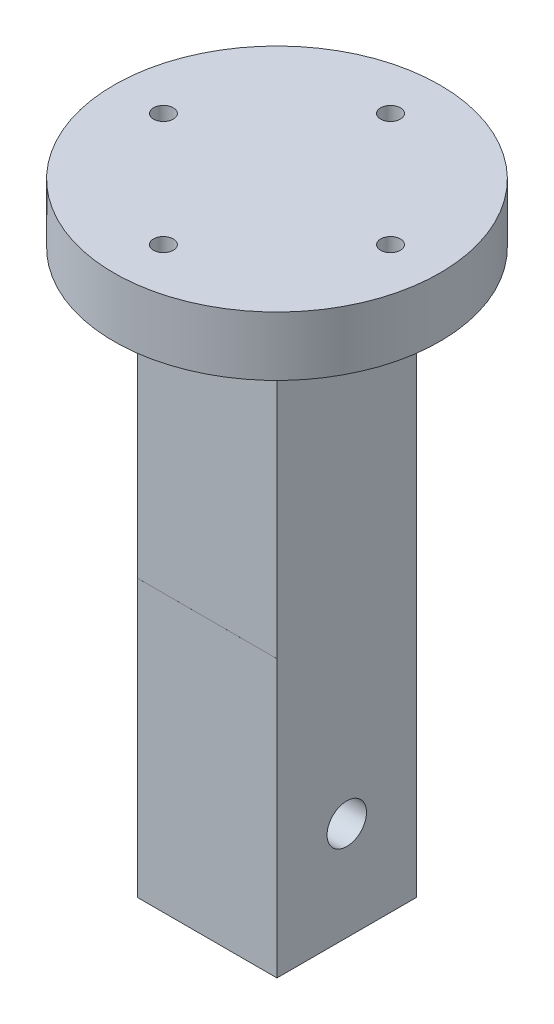
ISO-10303-21;
HEADER;
FILE_DESCRIPTION(('STEP AP214'),'2;1');
FILE_NAME('part.step','',(''),(''),'','','');
FILE_SCHEMA(('AUTOMOTIVE_DESIGN { 1 0 10303 214 1 1 1 1 }'));
ENDSEC;
DATA;
#1=APPLICATION_CONTEXT('core data for automotive mechanical design processes');
#2=APPLICATION_PROTOCOL_DEFINITION('international standard','automotive_design',2000,#1);
#3=PRODUCT_CONTEXT('',#1,'mechanical');
#4=PRODUCT('Part','Part','',(#3));
#5=PRODUCT_RELATED_PRODUCT_CATEGORY('part','',(#4));
#6=PRODUCT_DEFINITION_FORMATION('','',#4);
#7=PRODUCT_DEFINITION_CONTEXT('part definition',#1,'design');
#8=PRODUCT_DEFINITION('design','',#6,#7);
#9=PRODUCT_DEFINITION_SHAPE('','',#8);
#10=(LENGTH_UNIT() NAMED_UNIT(*) SI_UNIT(.MILLI.,.METRE.));
#11=(NAMED_UNIT(*) PLANE_ANGLE_UNIT() SI_UNIT($,.RADIAN.));
#12=(NAMED_UNIT(*) SI_UNIT($,.STERADIAN.) SOLID_ANGLE_UNIT());
#13=UNCERTAINTY_MEASURE_WITH_UNIT(LENGTH_MEASURE(1.E-05),#10,'distance_accuracy_value','');
#14=(GEOMETRIC_REPRESENTATION_CONTEXT(3) GLOBAL_UNCERTAINTY_ASSIGNED_CONTEXT((#13)) GLOBAL_UNIT_ASSIGNED_CONTEXT((#10,
#11,#12)) REPRESENTATION_CONTEXT('',''));
#15=CARTESIAN_POINT('',(0.,0.,0.));
#16=DIRECTION('',(0.,0.,1.));
#17=DIRECTION('',(1.,0.,0.));
#18=AXIS2_PLACEMENT_3D('',#15,#16,#17);
#19=CARTESIAN_POINT('',(0.,0.,0.));
#20=DIRECTION('',(0.,-1.,0.));
#21=DIRECTION('',(0.,0.,-1.));
#22=AXIS2_PLACEMENT_3D('',#19,#20,#21);
#23=PLANE('',#22);
#24=DIRECTION('',(0.,0.,-1.));
#25=VECTOR('',#24,1.);
#26=CARTESIAN_POINT('',(-4.49012806053458,0.,0.));
#27=LINE('',#26,#25);
#28=CARTESIAN_POINT('',(-4.49012806053458,0.,4.49012806053458));
#29=VERTEX_POINT('',#28);
#30=CARTESIAN_POINT('',(-4.49012806053458,0.,4.48953604302271));
#31=VERTEX_POINT('',#30);
#32=EDGE_CURVE('E107',#29,#31,#27,.T.);
#33=ORIENTED_EDGE('',*,*,#32,.F.);
#34=DIRECTION('',(-1.,0.,0.));
#35=VECTOR('',#34,1.);
#36=CARTESIAN_POINT('',(0.,0.,4.49012806053458));
#37=LINE('',#36,#35);
#38=CARTESIAN_POINT('',(4.49012806053458,0.,4.49012806053458));
#39=VERTEX_POINT('',#38);
#40=EDGE_CURVE('E112',#39,#29,#37,.T.);
#41=ORIENTED_EDGE('',*,*,#40,.F.);
#42=DIRECTION('',(0.,0.,1.));
#43=VECTOR('',#42,1.);
#44=CARTESIAN_POINT('',(4.49012806053458,0.,0.));
#45=LINE('',#44,#43);
#46=CARTESIAN_POINT('',(4.49012806053458,0.,4.48953604302271));
#47=VERTEX_POINT('',#46);
#48=EDGE_CURVE('E129',#47,#39,#45,.T.);
#49=ORIENTED_EDGE('',*,*,#48,.F.);
#50=DIRECTION('',(1.,0.,0.));
#51=VECTOR('',#50,1.);
#52=CARTESIAN_POINT('',(-4.49072,0.,4.48953604302271));
#53=LINE('',#52,#51);
#54=EDGE_CURVE('E125',#31,#47,#53,.T.);
#55=ORIENTED_EDGE('',*,*,#54,.F.);
#56=EDGE_LOOP('',(#33,#41,#49,#55));
#57=FACE_BOUND('',#56,.T.);
#58=ADVANCED_FACE('F35',(#57),#23,.F.);
#59=CARTESIAN_POINT('',(-4.49012806053458,0.,-4.48953604302271));
#60=VERTEX_POINT('',#59);
#61=CARTESIAN_POINT('',(-4.49012806053458,0.,-4.49012806053458));
#62=VERTEX_POINT('',#61);
#63=EDGE_CURVE('E144',#60,#62,#27,.T.);
#64=ORIENTED_EDGE('',*,*,#63,.F.);
#65=DIRECTION('',(-1.,0.,0.));
#66=VECTOR('',#65,1.);
#67=CARTESIAN_POINT('',(-4.49072,0.,-4.48953604302271));
#68=LINE('',#67,#66);
#69=CARTESIAN_POINT('',(4.49012806053458,0.,-4.48953604302271));
#70=VERTEX_POINT('',#69);
#71=EDGE_CURVE('E191',#70,#60,#68,.T.);
#72=ORIENTED_EDGE('',*,*,#71,.F.);
#73=CARTESIAN_POINT('',(4.49012806053458,0.,-4.49012806053458));
#74=VERTEX_POINT('',#73);
#75=EDGE_CURVE('E134',#74,#70,#45,.T.);
#76=ORIENTED_EDGE('',*,*,#75,.F.);
#77=DIRECTION('',(1.,0.,0.));
#78=VECTOR('',#77,1.);
#79=CARTESIAN_POINT('',(0.,0.,-4.49012806053458));
#80=LINE('',#79,#78);
#81=EDGE_CURVE('E130',#62,#74,#80,.T.);
#82=ORIENTED_EDGE('',*,*,#81,.F.);
#83=EDGE_LOOP('',(#64,#72,#76,#82));
#84=FACE_BOUND('',#83,.T.);
#85=ADVANCED_FACE('F202',(#84),#23,.F.);
#86=CARTESIAN_POINT('',(-4.49072,18.415,-4.48953604302271));
#87=DIRECTION('',(0.,0.,1.));
#88=DIRECTION('',(1.,0.,0.));
#89=AXIS2_PLACEMENT_3D('',#86,#87,#88);
#90=PLANE('',#89);
#91=DIRECTION('',(0.,-1.,0.));
#92=VECTOR('',#91,1.);
#93=CARTESIAN_POINT('',(-4.49012806053458,18.415,-4.48953604302271));
#94=LINE('',#93,#92);
#95=CARTESIAN_POINT('',(-4.49012806053458,18.415,-4.48953604302271));
#96=VERTEX_POINT('',#95);
#97=EDGE_CURVE('E143',#96,#60,#94,.T.);
#98=ORIENTED_EDGE('',*,*,#97,.F.);
#99=DIRECTION('',(-1.,0.,0.));
#100=VECTOR('',#99,1.);
#101=CARTESIAN_POINT('',(-4.49072,18.415,-4.48953604302271));
#102=LINE('',#101,#100);
#103=CARTESIAN_POINT('',(4.49012806053458,18.415,-4.48953604302271));
#104=VERTEX_POINT('',#103);
#105=EDGE_CURVE('E44',#104,#96,#102,.T.);
#106=ORIENTED_EDGE('',*,*,#105,.F.);
#107=DIRECTION('',(0.,1.,0.));
#108=VECTOR('',#107,1.);
#109=CARTESIAN_POINT('',(4.49012806053458,18.415,-4.48953604302271));
#110=LINE('',#109,#108);
#111=EDGE_CURVE('E132',#70,#104,#110,.T.);
#112=ORIENTED_EDGE('',*,*,#111,.F.);
#113=ORIENTED_EDGE('',*,*,#71,.T.);
#114=EDGE_LOOP('',(#98,#106,#112,#113));
#115=FACE_BOUND('',#114,.T.);
#116=ADVANCED_FACE('F37',(#115),#90,.F.);
#117=CARTESIAN_POINT('',(-4.49072,18.415,4.48953604302271));
#118=DIRECTION('',(0.,0.,-1.));
#119=DIRECTION('',(-1.,0.,0.));
#120=AXIS2_PLACEMENT_3D('',#117,#118,#119);
#121=PLANE('',#120);
#122=DIRECTION('',(0.,1.,0.));
#123=VECTOR('',#122,1.);
#124=CARTESIAN_POINT('',(-4.49012806053458,18.415,4.48953604302271));
#125=LINE('',#124,#123);
#126=CARTESIAN_POINT('',(-4.49012806053458,18.415,4.48953604302271));
#127=VERTEX_POINT('',#126);
#128=EDGE_CURVE('E101',#31,#127,#125,.T.);
#129=ORIENTED_EDGE('',*,*,#128,.F.);
#130=ORIENTED_EDGE('',*,*,#54,.T.);
#131=DIRECTION('',(0.,-1.,0.));
#132=VECTOR('',#131,1.);
#133=CARTESIAN_POINT('',(4.49012806053458,18.415,4.48953604302271));
#134=LINE('',#133,#132);
#135=CARTESIAN_POINT('',(4.49012806053458,18.415,4.48953604302271));
#136=VERTEX_POINT('',#135);
#137=EDGE_CURVE('E124',#136,#47,#134,.T.);
#138=ORIENTED_EDGE('',*,*,#137,.F.);
#139=DIRECTION('',(1.,0.,0.));
#140=VECTOR('',#139,1.);
#141=CARTESIAN_POINT('',(-4.49072,18.415,4.48953604302271));
#142=LINE('',#141,#140);
#143=EDGE_CURVE('E11',#127,#136,#142,.T.);
#144=ORIENTED_EDGE('',*,*,#143,.F.);
#145=EDGE_LOOP('',(#129,#130,#138,#144));
#146=FACE_BOUND('',#145,.T.);
#147=ADVANCED_FACE('F123',(#146),#121,.F.);
#148=CARTESIAN_POINT('',(0.,18.415,0.));
#149=DIRECTION('',(0.,1.,0.));
#150=DIRECTION('',(0.,0.,1.));
#151=AXIS2_PLACEMENT_3D('',#148,#149,#150);
#152=PLANE('',#151);
#153=DIRECTION('',(0.,0.,1.));
#154=VECTOR('',#153,1.);
#155=CARTESIAN_POINT('',(4.49012806053458,18.415,4.49012806053458));
#156=LINE('',#155,#154);
#157=EDGE_CURVE('E120',#104,#136,#156,.T.);
#158=ORIENTED_EDGE('',*,*,#157,.F.);
#159=ORIENTED_EDGE('',*,*,#105,.T.);
#160=DIRECTION('',(0.,0.,-1.));
#161=VECTOR('',#160,1.);
#162=CARTESIAN_POINT('',(-4.49012806053458,18.415,4.49012806053458));
#163=LINE('',#162,#161);
#164=EDGE_CURVE('E104',#127,#96,#163,.T.);
#165=ORIENTED_EDGE('',*,*,#164,.F.);
#166=ORIENTED_EDGE('',*,*,#143,.T.);
#167=EDGE_LOOP('',(#158,#159,#165,#166));
#168=FACE_BOUND('',#167,.T.);
#169=CARTESIAN_POINT('',(0.,18.415,-7.3025));
#170=DIRECTION('',(0.,1.,0.));
#171=DIRECTION('',(0.,0.,1.));
#172=AXIS2_PLACEMENT_3D('',#169,#170,#171);
#173=CIRCLE('',#172,0.635);
#174=CARTESIAN_POINT('',(0.,18.415,-6.6675));
#175=VERTEX_POINT('',#174);
#176=EDGE_CURVE('E184',#175,#175,#173,.T.);
#177=ORIENTED_EDGE('',*,*,#176,.T.);
#178=EDGE_LOOP('',(#177));
#179=FACE_BOUND('',#178,.T.);
#180=CARTESIAN_POINT('',(7.3025,18.415,0.));
#181=DIRECTION('',(0.,1.,0.));
#182=DIRECTION('',(0.,0.,1.));
#183=AXIS2_PLACEMENT_3D('',#180,#181,#182);
#184=CIRCLE('',#183,0.635000000000002);
#185=CARTESIAN_POINT('',(7.3025,18.415,0.635000000000002));
#186=VERTEX_POINT('',#185);
#187=EDGE_CURVE('E181',#186,#186,#184,.T.);
#188=ORIENTED_EDGE('',*,*,#187,.T.);
#189=EDGE_LOOP('',(#188));
#190=FACE_BOUND('',#189,.T.);
#191=CARTESIAN_POINT('',(-7.3025,18.415,0.));
#192=DIRECTION('',(0.,1.,0.));
#193=DIRECTION('',(0.,0.,1.));
#194=AXIS2_PLACEMENT_3D('',#191,#192,#193);
#195=CIRCLE('',#194,0.635000000000001);
#196=CARTESIAN_POINT('',(-7.3025,18.415,0.635000000000001));
#197=VERTEX_POINT('',#196);
#198=EDGE_CURVE('E178',#197,#197,#195,.T.);
#199=ORIENTED_EDGE('',*,*,#198,.T.);
#200=EDGE_LOOP('',(#199));
#201=FACE_BOUND('',#200,.T.);
#202=CARTESIAN_POINT('',(0.,18.415,7.3025));
#203=DIRECTION('',(0.,1.,0.));
#204=DIRECTION('',(0.,0.,1.));
#205=AXIS2_PLACEMENT_3D('',#202,#203,#204);
#206=CIRCLE('',#205,0.635);
#207=CARTESIAN_POINT('',(0.,18.415,7.9375));
#208=VERTEX_POINT('',#207);
#209=EDGE_CURVE('E167',#208,#208,#206,.T.);
#210=ORIENTED_EDGE('',*,*,#209,.T.);
#211=EDGE_LOOP('',(#210));
#212=FACE_BOUND('',#211,.T.);
#213=CARTESIAN_POINT('',(0.,18.415,0.));
#214=DIRECTION('',(0.,1.,0.));
#215=DIRECTION('',(0.,0.,1.));
#216=AXIS2_PLACEMENT_3D('',#213,#214,#215);
#217=CIRCLE('',#216,10.4775);
#218=CARTESIAN_POINT('',(0.,18.415,-10.4775));
#219=VERTEX_POINT('',#218);
#220=EDGE_CURVE('E187',#219,#219,#217,.T.);
#221=ORIENTED_EDGE('',*,*,#220,.F.);
#222=EDGE_LOOP('',(#221));
#223=FACE_BOUND('',#222,.T.);
#224=ADVANCED_FACE('F117',(#168,#179,#190,#201,#212,#223),#152,.F.);
#225=CARTESIAN_POINT('',(0.,22.225,0.));
#226=DIRECTION('',(0.,-1.,0.));
#227=DIRECTION('',(0.,0.,-1.));
#228=AXIS2_PLACEMENT_3D('',#225,#226,#227);
#229=CYLINDRICAL_SURFACE('',#228,10.4775);
#230=CARTESIAN_POINT('',(0.,22.225,0.));
#231=DIRECTION('',(0.,1.,0.));
#232=DIRECTION('',(0.,0.,1.));
#233=AXIS2_PLACEMENT_3D('',#230,#231,#232);
#234=CIRCLE('',#233,10.4775);
#235=CARTESIAN_POINT('',(0.,22.225,-10.4775));
#236=VERTEX_POINT('',#235);
#237=EDGE_CURVE('E188',#236,#236,#234,.T.);
#238=CARTESIAN_POINT('',(0.,22.225,-10.4775));
#239=CARTESIAN_POINT('',(0.,22.1853125,-10.4775));
#240=CARTESIAN_POINT('',(0.,22.145625,-10.4775));
#241=CARTESIAN_POINT('',(0.,22.06625,-10.4775));
#242=CARTESIAN_POINT('',(0.,22.0265625,-10.4775));
#243=CARTESIAN_POINT('',(0.,21.9471875,-10.4775));
#244=CARTESIAN_POINT('',(0.,21.9075,-10.4775));
#245=CARTESIAN_POINT('',(0.,21.828125,-10.4775));
#246=CARTESIAN_POINT('',(0.,21.7884375,-10.4775));
#247=CARTESIAN_POINT('',(0.,21.7090625,-10.4775));
#248=CARTESIAN_POINT('',(0.,21.669375,-10.4775));
#249=CARTESIAN_POINT('',(0.,21.59,-10.4775));
#250=CARTESIAN_POINT('',(0.,21.5503125,-10.4775));
#251=CARTESIAN_POINT('',(0.,21.4709375,-10.4775));
#252=CARTESIAN_POINT('',(0.,21.43125,-10.4775));
#253=CARTESIAN_POINT('',(0.,21.351875,-10.4775));
#254=CARTESIAN_POINT('',(0.,21.3121875,-10.4775));
#255=CARTESIAN_POINT('',(0.,21.2328125,-10.4775));
#256=CARTESIAN_POINT('',(0.,21.193125,-10.4775));
#257=CARTESIAN_POINT('',(0.,21.11375,-10.4775));
#258=CARTESIAN_POINT('',(0.,21.0740625,-10.4775));
#259=CARTESIAN_POINT('',(0.,20.9946875,-10.4775));
#260=CARTESIAN_POINT('',(0.,20.955,-10.4775));
#261=CARTESIAN_POINT('',(0.,20.875625,-10.4775));
#262=CARTESIAN_POINT('',(0.,20.8359375,-10.4775));
#263=CARTESIAN_POINT('',(0.,20.7565625,-10.4775));
#264=CARTESIAN_POINT('',(0.,20.716875,-10.4775));
#265=CARTESIAN_POINT('',(0.,20.6375,-10.4775));
#266=CARTESIAN_POINT('',(0.,20.5978125,-10.4775));
#267=CARTESIAN_POINT('',(0.,20.5184375,-10.4775));
#268=CARTESIAN_POINT('',(0.,20.47875,-10.4775));
#269=CARTESIAN_POINT('',(0.,20.399375,-10.4775));
#270=CARTESIAN_POINT('',(0.,20.3596875,-10.4775));
#271=CARTESIAN_POINT('',(0.,20.2803125,-10.4775));
#272=CARTESIAN_POINT('',(0.,20.240625,-10.4775));
#273=CARTESIAN_POINT('',(0.,20.16125,-10.4775));
#274=CARTESIAN_POINT('',(0.,20.1215625,-10.4775));
#275=CARTESIAN_POINT('',(0.,20.0421875,-10.4775));
#276=CARTESIAN_POINT('',(0.,20.0025,-10.4775));
#277=CARTESIAN_POINT('',(0.,19.923125,-10.4775));
#278=CARTESIAN_POINT('',(0.,19.8834375,-10.4775));
#279=CARTESIAN_POINT('',(0.,19.8040625,-10.4775));
#280=CARTESIAN_POINT('',(0.,19.764375,-10.4775));
#281=CARTESIAN_POINT('',(0.,19.685,-10.4775));
#282=CARTESIAN_POINT('',(0.,19.6453125,-10.4775));
#283=CARTESIAN_POINT('',(0.,19.5659375,-10.4775));
#284=CARTESIAN_POINT('',(0.,19.52625,-10.4775));
#285=CARTESIAN_POINT('',(0.,19.446875,-10.4775));
#286=CARTESIAN_POINT('',(0.,19.4071875,-10.4775));
#287=CARTESIAN_POINT('',(0.,19.3278125,-10.4775));
#288=CARTESIAN_POINT('',(0.,19.288125,-10.4775));
#289=CARTESIAN_POINT('',(0.,19.20875,-10.4775));
#290=CARTESIAN_POINT('',(0.,19.1690625,-10.4775));
#291=CARTESIAN_POINT('',(0.,19.0896875,-10.4775));
#292=CARTESIAN_POINT('',(0.,19.05,-10.4775));
#293=CARTESIAN_POINT('',(0.,18.970625,-10.4775));
#294=CARTESIAN_POINT('',(0.,18.9309375,-10.4775));
#295=CARTESIAN_POINT('',(0.,18.8515625,-10.4775));
#296=CARTESIAN_POINT('',(0.,18.811875,-10.4775));
#297=CARTESIAN_POINT('',(0.,18.7325,-10.4775));
#298=CARTESIAN_POINT('',(0.,18.6928125,-10.4775));
#299=CARTESIAN_POINT('',(0.,18.6134375,-10.4775));
#300=CARTESIAN_POINT('',(0.,18.57375,-10.4775));
#301=CARTESIAN_POINT('',(0.,18.494375,-10.4775));
#302=CARTESIAN_POINT('',(0.,18.4546875,-10.4775));
#303=CARTESIAN_POINT('',(0.,18.415,-10.4775));
#304=B_SPLINE_CURVE_WITH_KNOTS('',3,(#238,#239,#240,#241,#242,#243,#244,#245,#246,#247,#248,
#249,#250,#251,#252,#253,#254,#255,#256,#257,#258,#259,#260,#261,#262,#263,#264,#265,#266,#267,
#268,#269,#270,#271,#272,#273,#274,#275,#276,#277,#278,#279,#280,#281,#282,#283,#284,#285,#286,
#287,#288,#289,#290,#291,#292,#293,#294,#295,#296,#297,#298,#299,#300,#301,#302,#303),
.UNSPECIFIED.,.F.,.F.,(4,2,2,2,2,2,2,2,2,2,2,2,2,2,2,2,2,2,2,2,2,2,2,2,2,2,2,2,2,2,2,2,4),(0.,
0.119062499999999,0.238124999999999,0.357187499999998,0.476249999999998,0.595312499999997,
0.714375,0.833437499999999,0.952499999999998,1.0715625,1.190625,1.3096875,1.42875,1.5478125,
1.666875,1.7859375,1.905,2.0240625,2.143125,2.2621875,2.38125,2.5003125,2.619375,2.7384375,
2.8575,2.9765625,3.095625,3.2146875,3.33375,3.4528125,3.571875,3.6909375,3.81),.UNSPECIFIED.);
#305=EDGE_CURVE('BSEAM228',#236,#219,#304,.T.);
#306=ORIENTED_EDGE('',*,*,#237,.F.);
#307=ORIENTED_EDGE('',*,*,#220,.T.);
#308=ORIENTED_EDGE('',*,*,#305,.T.);
#309=ORIENTED_EDGE('',*,*,#305,.F.);
#310=EDGE_LOOP('',(#306,#308,#307,#309));
#311=FACE_BOUND('',#310,.T.);
#312=ADVANCED_FACE('F228',(#311),#229,.T.);
#313=CARTESIAN_POINT('',(0.,22.225,0.));
#314=DIRECTION('',(0.,1.,0.));
#315=DIRECTION('',(0.,0.,1.));
#316=AXIS2_PLACEMENT_3D('',#313,#314,#315);
#317=PLANE('',#316);
#318=CARTESIAN_POINT('',(0.,22.225,-7.3025));
#319=DIRECTION('',(0.,1.,0.));
#320=DIRECTION('',(0.,0.,1.));
#321=AXIS2_PLACEMENT_3D('',#318,#319,#320);
#322=CIRCLE('',#321,0.635);
#323=CARTESIAN_POINT('',(0.,22.225,-6.6675));
#324=VERTEX_POINT('',#323);
#325=EDGE_CURVE('E164',#324,#324,#322,.T.);
#326=ORIENTED_EDGE('',*,*,#325,.F.);
#327=EDGE_LOOP('',(#326));
#328=FACE_BOUND('',#327,.T.);
#329=CARTESIAN_POINT('',(7.3025,22.225,0.));
#330=DIRECTION('',(0.,1.,0.));
#331=DIRECTION('',(0.,0.,1.));
#332=AXIS2_PLACEMENT_3D('',#329,#330,#331);
#333=CIRCLE('',#332,0.635000000000002);
#334=CARTESIAN_POINT('',(7.3025,22.225,0.635000000000002));
#335=VERTEX_POINT('',#334);
#336=EDGE_CURVE('E168',#335,#335,#333,.T.);
#337=ORIENTED_EDGE('',*,*,#336,.F.);
#338=EDGE_LOOP('',(#337));
#339=FACE_BOUND('',#338,.T.);
#340=CARTESIAN_POINT('',(-7.3025,22.225,0.));
#341=DIRECTION('',(0.,1.,0.));
#342=DIRECTION('',(0.,0.,1.));
#343=AXIS2_PLACEMENT_3D('',#340,#341,#342);
#344=CIRCLE('',#343,0.635000000000001);
#345=CARTESIAN_POINT('',(-7.3025,22.225,0.635000000000001));
#346=VERTEX_POINT('',#345);
#347=EDGE_CURVE('E171',#346,#346,#344,.T.);
#348=ORIENTED_EDGE('',*,*,#347,.F.);
#349=EDGE_LOOP('',(#348));
#350=FACE_BOUND('',#349,.T.);
#351=CARTESIAN_POINT('',(0.,22.225,7.3025));
#352=DIRECTION('',(0.,1.,0.));
#353=DIRECTION('',(0.,0.,1.));
#354=AXIS2_PLACEMENT_3D('',#351,#352,#353);
#355=CIRCLE('',#354,0.635);
#356=CARTESIAN_POINT('',(0.,22.225,7.9375));
#357=VERTEX_POINT('',#356);
#358=EDGE_CURVE('E163',#357,#357,#355,.T.);
#359=ORIENTED_EDGE('',*,*,#358,.F.);
#360=EDGE_LOOP('',(#359));
#361=FACE_BOUND('',#360,.T.);
#362=ORIENTED_EDGE('',*,*,#237,.T.);
#363=EDGE_LOOP('',(#362));
#364=FACE_BOUND('',#363,.T.);
#365=ADVANCED_FACE('F225',(#328,#339,#350,#361,#364),#317,.T.);
#366=CARTESIAN_POINT('',(0.,17.145,7.3025));
#367=DIRECTION('',(0.,1.,0.));
#368=DIRECTION('',(0.,0.,1.));
#369=AXIS2_PLACEMENT_3D('',#366,#367,#368);
#370=CYLINDRICAL_SURFACE('',#369,0.635);
#371=ORIENTED_EDGE('',*,*,#358,.T.);
#372=EDGE_LOOP('',(#371));
#373=FACE_BOUND('',#372,.T.);
#374=ORIENTED_EDGE('',*,*,#209,.F.);
#375=EDGE_LOOP('',(#374));
#376=FACE_BOUND('',#375,.T.);
#377=ADVANCED_FACE('F223',(#373,#376),#370,.F.);
#378=CARTESIAN_POINT('',(-7.3025,17.145,0.));
#379=DIRECTION('',(0.,1.,0.));
#380=DIRECTION('',(0.,0.,1.));
#381=AXIS2_PLACEMENT_3D('',#378,#379,#380);
#382=CYLINDRICAL_SURFACE('',#381,0.635000000000001);
#383=ORIENTED_EDGE('',*,*,#347,.T.);
#384=EDGE_LOOP('',(#383));
#385=FACE_BOUND('',#384,.T.);
#386=ORIENTED_EDGE('',*,*,#198,.F.);
#387=EDGE_LOOP('',(#386));
#388=FACE_BOUND('',#387,.T.);
#389=ADVANCED_FACE('F291',(#385,#388),#382,.F.);
#390=CARTESIAN_POINT('',(7.3025,17.145,0.));
#391=DIRECTION('',(0.,1.,0.));
#392=DIRECTION('',(0.,0.,1.));
#393=AXIS2_PLACEMENT_3D('',#390,#391,#392);
#394=CYLINDRICAL_SURFACE('',#393,0.635000000000002);
#395=ORIENTED_EDGE('',*,*,#336,.T.);
#396=EDGE_LOOP('',(#395));
#397=FACE_BOUND('',#396,.T.);
#398=ORIENTED_EDGE('',*,*,#187,.F.);
#399=EDGE_LOOP('',(#398));
#400=FACE_BOUND('',#399,.T.);
#401=ADVANCED_FACE('F280',(#397,#400),#394,.F.);
#402=CARTESIAN_POINT('',(0.,17.145,-7.3025));
#403=DIRECTION('',(0.,1.,0.));
#404=DIRECTION('',(0.,0.,1.));
#405=AXIS2_PLACEMENT_3D('',#402,#403,#404);
#406=CYLINDRICAL_SURFACE('',#405,0.635);
#407=ORIENTED_EDGE('',*,*,#325,.T.);
#408=EDGE_LOOP('',(#407));
#409=FACE_BOUND('',#408,.T.);
#410=ORIENTED_EDGE('',*,*,#176,.F.);
#411=EDGE_LOOP('',(#410));
#412=FACE_BOUND('',#411,.T.);
#413=ADVANCED_FACE('F259',(#409,#412),#406,.F.);
#414=CARTESIAN_POINT('',(-11.7475,-11.43,0.));
#415=DIRECTION('',(1.,0.,0.));
#416=DIRECTION('',(0.,0.,-1.));
#417=AXIS2_PLACEMENT_3D('',#414,#415,#416);
#418=CYLINDRICAL_SURFACE('',#417,1.27);
#419=CARTESIAN_POINT('',(4.49012806053458,-11.43,0.));
#420=DIRECTION('',(1.,0.,0.));
#421=DIRECTION('',(0.,0.,-1.));
#422=AXIS2_PLACEMENT_3D('',#419,#420,#421);
#423=CIRCLE('',#422,1.27);
#424=CARTESIAN_POINT('',(4.49012806053458,-11.43,-1.27));
#425=VERTEX_POINT('',#424);
#426=EDGE_CURVE('E146',#425,#425,#423,.T.);
#427=ORIENTED_EDGE('',*,*,#426,.T.);
#428=EDGE_LOOP('',(#427));
#429=FACE_BOUND('',#428,.T.);
#430=CARTESIAN_POINT('',(-4.49012806053458,-11.43,0.));
#431=DIRECTION('',(1.,0.,0.));
#432=DIRECTION('',(0.,0.,-1.));
#433=AXIS2_PLACEMENT_3D('',#430,#431,#432);
#434=CIRCLE('',#433,1.27);
#435=CARTESIAN_POINT('',(-4.49012806053458,-11.43,-1.27));
#436=VERTEX_POINT('',#435);
#437=EDGE_CURVE('E39',#436,#436,#434,.T.);
#438=ORIENTED_EDGE('',*,*,#437,.F.);
#439=EDGE_LOOP('',(#438));
#440=FACE_BOUND('',#439,.T.);
#441=ADVANCED_FACE('F254',(#429,#440),#418,.F.);
#442=CARTESIAN_POINT('',(0.,-17.78,0.));
#443=DIRECTION('',(0.,-1.,0.));
#444=DIRECTION('',(0.,0.,-1.));
#445=AXIS2_PLACEMENT_3D('',#442,#443,#444);
#446=PLANE('',#445);
#447=DIRECTION('',(0.,0.,1.));
#448=VECTOR('',#447,1.);
#449=CARTESIAN_POINT('',(4.49012806053458,-17.78,4.49012806053458));
#450=LINE('',#449,#448);
#451=CARTESIAN_POINT('',(4.49012806053458,-17.78,-4.49012806053458));
#452=VERTEX_POINT('',#451);
#453=CARTESIAN_POINT('',(4.49012806053458,-17.78,4.49012806053458));
#454=VERTEX_POINT('',#453);
#455=EDGE_CURVE('E149',#452,#454,#450,.T.);
#456=ORIENTED_EDGE('',*,*,#455,.T.);
#457=DIRECTION('',(-1.,0.,0.));
#458=VECTOR('',#457,1.);
#459=CARTESIAN_POINT('',(-4.49012806053458,-17.78,4.49012806053458));
#460=LINE('',#459,#458);
#461=CARTESIAN_POINT('',(-4.49012806053458,-17.78,4.49012806053458));
#462=VERTEX_POINT('',#461);
#463=EDGE_CURVE('E151',#454,#462,#460,.T.);
#464=ORIENTED_EDGE('',*,*,#463,.T.);
#465=DIRECTION('',(0.,0.,-1.));
#466=VECTOR('',#465,1.);
#467=CARTESIAN_POINT('',(-4.49012806053458,-17.78,4.49012806053458));
#468=LINE('',#467,#466);
#469=CARTESIAN_POINT('',(-4.49012806053457,-17.78,-4.49012806053458));
#470=VERTEX_POINT('',#469);
#471=EDGE_CURVE('E57',#462,#470,#468,.T.);
#472=ORIENTED_EDGE('',*,*,#471,.T.);
#473=DIRECTION('',(1.,0.,0.));
#474=VECTOR('',#473,1.);
#475=CARTESIAN_POINT('',(-4.49012806053457,-17.78,-4.49012806053458));
#476=LINE('',#475,#474);
#477=EDGE_CURVE('E52',#470,#452,#476,.T.);
#478=ORIENTED_EDGE('',*,*,#477,.T.);
#479=EDGE_LOOP('',(#456,#464,#472,#478));
#480=FACE_BOUND('',#479,.T.);
#481=ADVANCED_FACE('F210',(#480),#446,.T.);
#482=CARTESIAN_POINT('',(-4.49012806053457,-17.78,-4.49012806053458));
#483=DIRECTION('',(0.,0.,1.));
#484=DIRECTION('',(1.,0.,0.));
#485=AXIS2_PLACEMENT_3D('',#482,#483,#484);
#486=PLANE('',#485);
#487=DIRECTION('',(0.,1.,0.));
#488=VECTOR('',#487,1.);
#489=CARTESIAN_POINT('',(-4.49012806053457,-17.78,-4.49012806053458));
#490=LINE('',#489,#488);
#491=EDGE_CURVE('E157',#470,#62,#490,.T.);
#492=ORIENTED_EDGE('',*,*,#491,.T.);
#493=ORIENTED_EDGE('',*,*,#81,.T.);
#494=DIRECTION('',(0.,1.,0.));
#495=VECTOR('',#494,1.);
#496=CARTESIAN_POINT('',(4.49012806053458,-17.78,-4.49012806053458));
#497=LINE('',#496,#495);
#498=EDGE_CURVE('E155',#452,#74,#497,.T.);
#499=ORIENTED_EDGE('',*,*,#498,.F.);
#500=ORIENTED_EDGE('',*,*,#477,.F.);
#501=EDGE_LOOP('',(#492,#493,#499,#500));
#502=FACE_BOUND('',#501,.T.);
#503=ADVANCED_FACE('F206',(#502),#486,.F.);
#504=CARTESIAN_POINT('',(-4.49012806053458,-17.78,4.49012806053458));
#505=DIRECTION('',(1.,0.,0.));
#506=DIRECTION('',(0.,0.,-1.));
#507=AXIS2_PLACEMENT_3D('',#504,#505,#506);
#508=PLANE('',#507);
#509=ORIENTED_EDGE('',*,*,#437,.T.);
#510=EDGE_LOOP('',(#509));
#511=FACE_BOUND('',#510,.T.);
#512=DIRECTION('',(0.,1.,0.));
#513=VECTOR('',#512,1.);
#514=CARTESIAN_POINT('',(-4.49012806053458,-17.78,4.49012806053458));
#515=LINE('',#514,#513);
#516=EDGE_CURVE('E159',#462,#29,#515,.T.);
#517=ORIENTED_EDGE('',*,*,#516,.T.);
#518=ORIENTED_EDGE('',*,*,#32,.T.);
#519=ORIENTED_EDGE('',*,*,#128,.T.);
#520=ORIENTED_EDGE('',*,*,#164,.T.);
#521=ORIENTED_EDGE('',*,*,#97,.T.);
#522=ORIENTED_EDGE('',*,*,#63,.T.);
#523=ORIENTED_EDGE('',*,*,#491,.F.);
#524=ORIENTED_EDGE('',*,*,#471,.F.);
#525=EDGE_LOOP('',(#517,#518,#519,#520,#521,#522,#523,#524));
#526=FACE_BOUND('',#525,.T.);
#527=ADVANCED_FACE('F103',(#511,#526),#508,.F.);
#528=CARTESIAN_POINT('',(-4.49012806053458,-17.78,4.49012806053458));
#529=DIRECTION('',(0.,0.,-1.));
#530=DIRECTION('',(-1.,0.,0.));
#531=AXIS2_PLACEMENT_3D('',#528,#529,#530);
#532=PLANE('',#531);
#533=DIRECTION('',(0.,1.,0.));
#534=VECTOR('',#533,1.);
#535=CARTESIAN_POINT('',(4.49012806053458,-17.78,4.49012806053458));
#536=LINE('',#535,#534);
#537=EDGE_CURVE('E161',#454,#39,#536,.T.);
#538=ORIENTED_EDGE('',*,*,#537,.T.);
#539=ORIENTED_EDGE('',*,*,#40,.T.);
#540=ORIENTED_EDGE('',*,*,#516,.F.);
#541=ORIENTED_EDGE('',*,*,#463,.F.);
#542=EDGE_LOOP('',(#538,#539,#540,#541));
#543=FACE_BOUND('',#542,.T.);
#544=ADVANCED_FACE('F213',(#543),#532,.F.);
#545=CARTESIAN_POINT('',(4.49012806053458,-17.78,4.49012806053458));
#546=DIRECTION('',(-1.,0.,0.));
#547=DIRECTION('',(0.,0.,1.));
#548=AXIS2_PLACEMENT_3D('',#545,#546,#547);
#549=PLANE('',#548);
#550=ORIENTED_EDGE('',*,*,#426,.F.);
#551=EDGE_LOOP('',(#550));
#552=FACE_BOUND('',#551,.T.);
#553=ORIENTED_EDGE('',*,*,#498,.T.);
#554=ORIENTED_EDGE('',*,*,#75,.T.);
#555=ORIENTED_EDGE('',*,*,#111,.T.);
#556=ORIENTED_EDGE('',*,*,#157,.T.);
#557=ORIENTED_EDGE('',*,*,#137,.T.);
#558=ORIENTED_EDGE('',*,*,#48,.T.);
#559=ORIENTED_EDGE('',*,*,#537,.F.);
#560=ORIENTED_EDGE('',*,*,#455,.F.);
#561=EDGE_LOOP('',(#553,#554,#555,#556,#557,#558,#559,#560));
#562=FACE_BOUND('',#561,.T.);
#563=ADVANCED_FACE('F209',(#552,#562),#549,.F.);
#564=CLOSED_SHELL('',(#58,#85,#116,#147,#224,#312,#365,#377,#389,#401,#413,#441,#481,#503,#527,
#544,#563));
#565=MANIFOLD_SOLID_BREP('B2',#564);
#566=ADVANCED_BREP_SHAPE_REPRESENTATION('',(#18,#565),#14);
#567=SHAPE_DEFINITION_REPRESENTATION(#9,#566);
ENDSEC;
END-ISO-10303-21;
